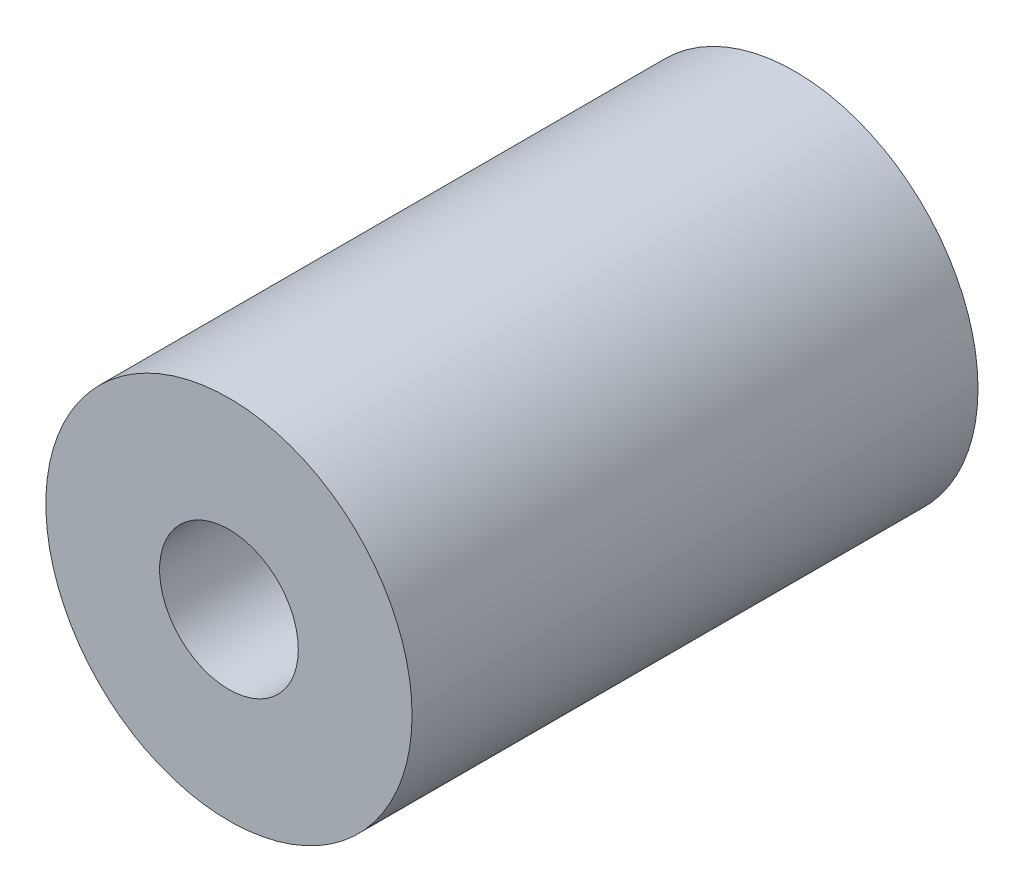
ISO-10303-21;
HEADER;
FILE_DESCRIPTION(('STEP AP214'),'2;1');
FILE_NAME('part.step','',(''),(''),'','','');
FILE_SCHEMA(('AUTOMOTIVE_DESIGN { 1 0 10303 214 1 1 1 1 }'));
ENDSEC;
DATA;
#1=APPLICATION_CONTEXT('core data for automotive mechanical design processes');
#2=APPLICATION_PROTOCOL_DEFINITION('international standard','automotive_design',2000,#1);
#3=PRODUCT_CONTEXT('',#1,'mechanical');
#4=PRODUCT('Part','Part','',(#3));
#5=PRODUCT_RELATED_PRODUCT_CATEGORY('part','',(#4));
#6=PRODUCT_DEFINITION_FORMATION('','',#4);
#7=PRODUCT_DEFINITION_CONTEXT('part definition',#1,'design');
#8=PRODUCT_DEFINITION('design','',#6,#7);
#9=PRODUCT_DEFINITION_SHAPE('','',#8);
#10=(LENGTH_UNIT() NAMED_UNIT(*) SI_UNIT(.MILLI.,.METRE.));
#11=(NAMED_UNIT(*) PLANE_ANGLE_UNIT() SI_UNIT($,.RADIAN.));
#12=(NAMED_UNIT(*) SI_UNIT($,.STERADIAN.) SOLID_ANGLE_UNIT());
#13=UNCERTAINTY_MEASURE_WITH_UNIT(LENGTH_MEASURE(1.E-05),#10,'distance_accuracy_value','');
#14=(GEOMETRIC_REPRESENTATION_CONTEXT(3) GLOBAL_UNCERTAINTY_ASSIGNED_CONTEXT((#13)) GLOBAL_UNIT_ASSIGNED_CONTEXT((#10,
#11,#12)) REPRESENTATION_CONTEXT('',''));
#15=CARTESIAN_POINT('',(0.,0.,0.));
#16=DIRECTION('',(0.,0.,1.));
#17=DIRECTION('',(1.,0.,0.));
#18=AXIS2_PLACEMENT_3D('',#15,#16,#17);
#19=CARTESIAN_POINT('',(0.,0.,102.));
#20=DIRECTION('',(0.,0.,1.));
#21=DIRECTION('',(1.,0.,0.));
#22=AXIS2_PLACEMENT_3D('',#19,#20,#21);
#23=PLANE('',#22);
#24=CARTESIAN_POINT('',(0.,0.,102.));
#25=DIRECTION('',(0.,0.,1.));
#26=DIRECTION('',(1.,0.,0.));
#27=AXIS2_PLACEMENT_3D('',#24,#25,#26);
#28=CIRCLE('',#27,33.);
#29=CARTESIAN_POINT('',(33.,0.,102.));
#30=VERTEX_POINT('',#29);
#31=EDGE_CURVE('E10',#30,#30,#28,.T.);
#32=ORIENTED_EDGE('',*,*,#31,.T.);
#33=EDGE_LOOP('',(#32));
#34=FACE_BOUND('',#33,.T.);
#35=CARTESIAN_POINT('',(0.,0.,102.));
#36=DIRECTION('',(0.,0.,1.));
#37=DIRECTION('',(1.,0.,0.));
#38=AXIS2_PLACEMENT_3D('',#35,#36,#37);
#39=CIRCLE('',#38,12.5);
#40=CARTESIAN_POINT('',(12.5,0.,102.));
#41=VERTEX_POINT('',#40);
#42=EDGE_CURVE('E52',#41,#41,#39,.T.);
#43=ORIENTED_EDGE('',*,*,#42,.F.);
#44=EDGE_LOOP('',(#43));
#45=FACE_BOUND('',#44,.T.);
#46=ADVANCED_FACE('F39',(#34,#45),#23,.T.);
#47=CARTESIAN_POINT('',(0.,0.,0.));
#48=DIRECTION('',(0.,0.,1.));
#49=DIRECTION('',(1.,0.,0.));
#50=AXIS2_PLACEMENT_3D('',#47,#48,#49);
#51=PLANE('',#50);
#52=CARTESIAN_POINT('',(0.,0.,0.));
#53=DIRECTION('',(0.,0.,1.));
#54=DIRECTION('',(1.,0.,0.));
#55=AXIS2_PLACEMENT_3D('',#52,#53,#54);
#56=CIRCLE('',#55,33.);
#57=CARTESIAN_POINT('',(33.,0.,0.));
#58=VERTEX_POINT('',#57);
#59=EDGE_CURVE('E43',#58,#58,#56,.T.);
#60=ORIENTED_EDGE('',*,*,#59,.F.);
#61=EDGE_LOOP('',(#60));
#62=FACE_BOUND('',#61,.T.);
#63=CARTESIAN_POINT('',(0.,0.,0.));
#64=DIRECTION('',(0.,0.,1.));
#65=DIRECTION('',(1.,0.,0.));
#66=AXIS2_PLACEMENT_3D('',#63,#64,#65);
#67=CIRCLE('',#66,12.5);
#68=CARTESIAN_POINT('',(12.5,0.,0.));
#69=VERTEX_POINT('',#68);
#70=EDGE_CURVE('E54',#69,#69,#67,.T.);
#71=ORIENTED_EDGE('',*,*,#70,.T.);
#72=EDGE_LOOP('',(#71));
#73=FACE_BOUND('',#72,.T.);
#74=ADVANCED_FACE('F66',(#62,#73),#51,.F.);
#75=CARTESIAN_POINT('',(0.,0.,102.));
#76=DIRECTION('',(0.,0.,-1.));
#77=DIRECTION('',(-1.,0.,0.));
#78=AXIS2_PLACEMENT_3D('',#75,#76,#77);
#79=CYLINDRICAL_SURFACE('',#78,33.);
#80=ORIENTED_EDGE('',*,*,#31,.F.);
#81=EDGE_LOOP('',(#80));
#82=FACE_BOUND('',#81,.T.);
#83=ORIENTED_EDGE('',*,*,#59,.T.);
#84=EDGE_LOOP('',(#83));
#85=FACE_BOUND('',#84,.T.);
#86=ADVANCED_FACE('F41',(#82,#85),#79,.T.);
#87=CARTESIAN_POINT('',(0.,0.,102.));
#88=DIRECTION('',(0.,0.,-1.));
#89=DIRECTION('',(-1.,0.,0.));
#90=AXIS2_PLACEMENT_3D('',#87,#88,#89);
#91=CYLINDRICAL_SURFACE('',#90,12.5);
#92=ORIENTED_EDGE('',*,*,#42,.T.);
#93=EDGE_LOOP('',(#92));
#94=FACE_BOUND('',#93,.T.);
#95=ORIENTED_EDGE('',*,*,#70,.F.);
#96=EDGE_LOOP('',(#95));
#97=FACE_BOUND('',#96,.T.);
#98=ADVANCED_FACE('F62',(#94,#97),#91,.F.);
#99=CLOSED_SHELL('',(#46,#74,#86,#98));
#100=MANIFOLD_SOLID_BREP('B2',#99);
#101=ADVANCED_BREP_SHAPE_REPRESENTATION('',(#18,#100),#14);
#102=SHAPE_DEFINITION_REPRESENTATION(#9,#101);
ENDSEC;
END-ISO-10303-21;
